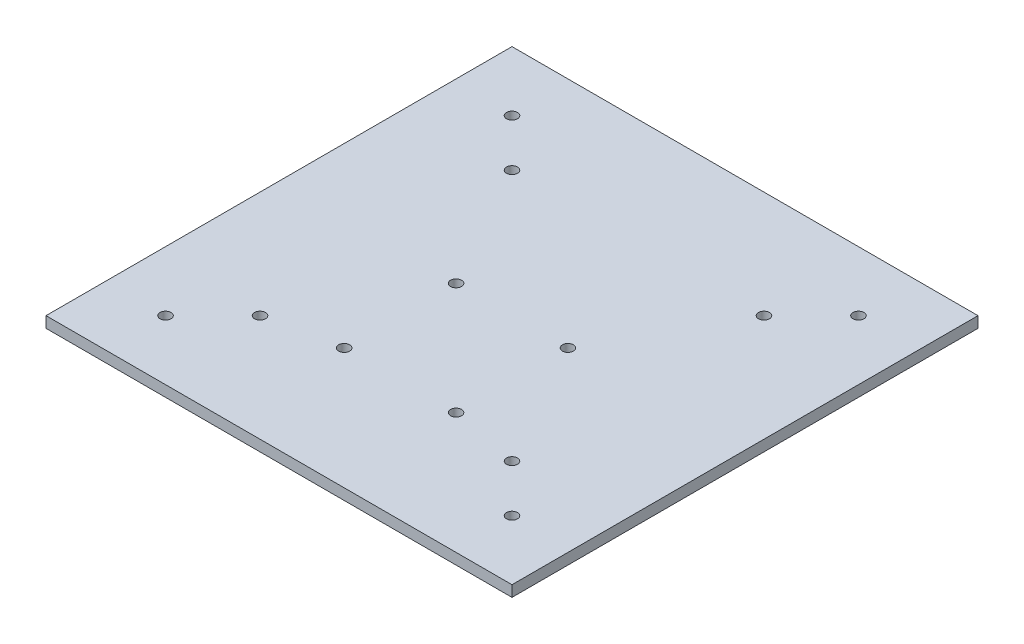
ISO-10303-21;
HEADER;
FILE_DESCRIPTION(('STEP AP214'),'2;1');
FILE_NAME('part.step','',(''),(''),'','','');
FILE_SCHEMA(('AUTOMOTIVE_DESIGN { 1 0 10303 214 1 1 1 1 }'));
ENDSEC;
DATA;
#1=APPLICATION_CONTEXT('core data for automotive mechanical design processes');
#2=APPLICATION_PROTOCOL_DEFINITION('international standard','automotive_design',2000,#1);
#3=PRODUCT_CONTEXT('',#1,'mechanical');
#4=PRODUCT('Part','Part','',(#3));
#5=PRODUCT_RELATED_PRODUCT_CATEGORY('part','',(#4));
#6=PRODUCT_DEFINITION_FORMATION('','',#4);
#7=PRODUCT_DEFINITION_CONTEXT('part definition',#1,'design');
#8=PRODUCT_DEFINITION('design','',#6,#7);
#9=PRODUCT_DEFINITION_SHAPE('','',#8);
#10=(LENGTH_UNIT() NAMED_UNIT(*) SI_UNIT(.MILLI.,.METRE.));
#11=(NAMED_UNIT(*) PLANE_ANGLE_UNIT() SI_UNIT($,.RADIAN.));
#12=(NAMED_UNIT(*) SI_UNIT($,.STERADIAN.) SOLID_ANGLE_UNIT());
#13=UNCERTAINTY_MEASURE_WITH_UNIT(LENGTH_MEASURE(1.E-05),#10,'distance_accuracy_value','');
#14=(GEOMETRIC_REPRESENTATION_CONTEXT(3) GLOBAL_UNCERTAINTY_ASSIGNED_CONTEXT((#13)) GLOBAL_UNIT_ASSIGNED_CONTEXT((#10,
#11,#12)) REPRESENTATION_CONTEXT('',''));
#15=CARTESIAN_POINT('',(0.,0.,0.));
#16=DIRECTION('',(0.,0.,1.));
#17=DIRECTION('',(1.,0.,0.));
#18=AXIS2_PLACEMENT_3D('',#15,#16,#17);
#19=CARTESIAN_POINT('',(-63.5,3.,-63.5));
#20=DIRECTION('',(1.,0.,0.));
#21=DIRECTION('',(0.,0.,-1.));
#22=AXIS2_PLACEMENT_3D('',#19,#20,#21);
#23=PLANE('',#22);
#24=DIRECTION('',(0.,0.,1.));
#25=VECTOR('',#24,1.);
#26=CARTESIAN_POINT('',(-63.5,0.,-63.5));
#27=LINE('',#26,#25);
#28=CARTESIAN_POINT('',(-63.5,0.,-63.5));
#29=VERTEX_POINT('',#28);
#30=CARTESIAN_POINT('',(-63.5,0.,63.5));
#31=VERTEX_POINT('',#30);
#32=EDGE_CURVE('E98',#29,#31,#27,.T.);
#33=ORIENTED_EDGE('',*,*,#32,.T.);
#34=DIRECTION('',(0.,-1.,0.));
#35=VECTOR('',#34,1.);
#36=CARTESIAN_POINT('',(-63.5,3.,63.5));
#37=LINE('',#36,#35);
#38=CARTESIAN_POINT('',(-63.5,3.,63.5));
#39=VERTEX_POINT('',#38);
#40=EDGE_CURVE('E11',#39,#31,#37,.T.);
#41=ORIENTED_EDGE('',*,*,#40,.F.);
#42=DIRECTION('',(0.,0.,1.));
#43=VECTOR('',#42,1.);
#44=CARTESIAN_POINT('',(-63.5,3.,-63.5));
#45=LINE('',#44,#43);
#46=CARTESIAN_POINT('',(-63.5,3.,-63.5));
#47=VERTEX_POINT('',#46);
#48=EDGE_CURVE('E85',#47,#39,#45,.T.);
#49=ORIENTED_EDGE('',*,*,#48,.F.);
#50=DIRECTION('',(0.,-1.,0.));
#51=VECTOR('',#50,1.);
#52=CARTESIAN_POINT('',(-63.5,3.,-63.5));
#53=LINE('',#52,#51);
#54=EDGE_CURVE('E94',#47,#29,#53,.T.);
#55=ORIENTED_EDGE('',*,*,#54,.T.);
#56=EDGE_LOOP('',(#33,#41,#49,#55));
#57=FACE_BOUND('',#56,.T.);
#58=ADVANCED_FACE('F32',(#57),#23,.F.);
#59=CARTESIAN_POINT('',(63.5,3.,63.5));
#60=DIRECTION('',(0.,0.,-1.));
#61=DIRECTION('',(-1.,0.,0.));
#62=AXIS2_PLACEMENT_3D('',#59,#60,#61);
#63=PLANE('',#62);
#64=DIRECTION('',(1.,0.,0.));
#65=VECTOR('',#64,1.);
#66=CARTESIAN_POINT('',(63.5,0.,63.5));
#67=LINE('',#66,#65);
#68=CARTESIAN_POINT('',(63.5,0.,63.5));
#69=VERTEX_POINT('',#68);
#70=EDGE_CURVE('E89',#31,#69,#67,.T.);
#71=ORIENTED_EDGE('',*,*,#70,.T.);
#72=DIRECTION('',(0.,-1.,0.));
#73=VECTOR('',#72,1.);
#74=CARTESIAN_POINT('',(63.5,3.,63.5));
#75=LINE('',#74,#73);
#76=CARTESIAN_POINT('',(63.5,3.,63.5));
#77=VERTEX_POINT('',#76);
#78=EDGE_CURVE('E41',#77,#69,#75,.T.);
#79=ORIENTED_EDGE('',*,*,#78,.F.);
#80=DIRECTION('',(1.,0.,0.));
#81=VECTOR('',#80,1.);
#82=CARTESIAN_POINT('',(63.5,3.,63.5));
#83=LINE('',#82,#81);
#84=EDGE_CURVE('E80',#39,#77,#83,.T.);
#85=ORIENTED_EDGE('',*,*,#84,.F.);
#86=ORIENTED_EDGE('',*,*,#40,.T.);
#87=EDGE_LOOP('',(#71,#79,#85,#86));
#88=FACE_BOUND('',#87,.T.);
#89=ADVANCED_FACE('F88',(#88),#63,.F.);
#90=CARTESIAN_POINT('',(63.5,3.,-63.5));
#91=DIRECTION('',(-1.,0.,0.));
#92=DIRECTION('',(0.,0.,1.));
#93=AXIS2_PLACEMENT_3D('',#90,#91,#92);
#94=PLANE('',#93);
#95=DIRECTION('',(0.,0.,-1.));
#96=VECTOR('',#95,1.);
#97=CARTESIAN_POINT('',(63.5,0.,-63.5));
#98=LINE('',#97,#96);
#99=CARTESIAN_POINT('',(63.5,0.,-63.5));
#100=VERTEX_POINT('',#99);
#101=EDGE_CURVE('E67',#69,#100,#98,.T.);
#102=ORIENTED_EDGE('',*,*,#101,.T.);
#103=DIRECTION('',(0.,-1.,0.));
#104=VECTOR('',#103,1.);
#105=CARTESIAN_POINT('',(63.5,3.,-63.5));
#106=LINE('',#105,#104);
#107=CARTESIAN_POINT('',(63.5,3.,-63.5));
#108=VERTEX_POINT('',#107);
#109=EDGE_CURVE('E90',#108,#100,#106,.T.);
#110=ORIENTED_EDGE('',*,*,#109,.F.);
#111=DIRECTION('',(0.,0.,-1.));
#112=VECTOR('',#111,1.);
#113=CARTESIAN_POINT('',(63.5,3.,-63.5));
#114=LINE('',#113,#112);
#115=EDGE_CURVE('E83',#77,#108,#114,.T.);
#116=ORIENTED_EDGE('',*,*,#115,.F.);
#117=ORIENTED_EDGE('',*,*,#78,.T.);
#118=EDGE_LOOP('',(#102,#110,#116,#117));
#119=FACE_BOUND('',#118,.T.);
#120=ADVANCED_FACE('F92',(#119),#94,.F.);
#121=CARTESIAN_POINT('',(63.5,3.,-63.5));
#122=DIRECTION('',(0.,0.,1.));
#123=DIRECTION('',(1.,0.,0.));
#124=AXIS2_PLACEMENT_3D('',#121,#122,#123);
#125=PLANE('',#124);
#126=DIRECTION('',(-1.,0.,0.));
#127=VECTOR('',#126,1.);
#128=CARTESIAN_POINT('',(63.5,0.,-63.5));
#129=LINE('',#128,#127);
#130=EDGE_CURVE('E73',#100,#29,#129,.T.);
#131=ORIENTED_EDGE('',*,*,#130,.T.);
#132=ORIENTED_EDGE('',*,*,#54,.F.);
#133=DIRECTION('',(-1.,0.,0.));
#134=VECTOR('',#133,1.);
#135=CARTESIAN_POINT('',(63.5,3.,-63.5));
#136=LINE('',#135,#134);
#137=EDGE_CURVE('E50',#108,#47,#136,.T.);
#138=ORIENTED_EDGE('',*,*,#137,.F.);
#139=ORIENTED_EDGE('',*,*,#109,.T.);
#140=EDGE_LOOP('',(#131,#132,#138,#139));
#141=FACE_BOUND('',#140,.T.);
#142=ADVANCED_FACE('F212',(#141),#125,.F.);
#143=CARTESIAN_POINT('',(0.,3.,0.));
#144=DIRECTION('',(0.,-1.,0.));
#145=DIRECTION('',(0.,0.,-1.));
#146=AXIS2_PLACEMENT_3D('',#143,#144,#145);
#147=PLANE('',#146);
#148=CARTESIAN_POINT('',(15.2500000000014,3.,0.));
#149=DIRECTION('',(0.,1.,0.));
#150=DIRECTION('',(0.,0.,1.));
#151=AXIS2_PLACEMENT_3D('',#148,#149,#150);
#152=CIRCLE('',#151,1.5);
#153=CARTESIAN_POINT('',(15.2500000000014,3.,1.50000000000001));
#154=VERTEX_POINT('',#153);
#155=EDGE_CURVE('E367',#154,#154,#152,.T.);
#156=ORIENTED_EDGE('',*,*,#155,.F.);
#157=EDGE_LOOP('',(#156));
#158=FACE_BOUND('',#157,.T.);
#159=CARTESIAN_POINT('',(-15.2499999999986,3.,30.5));
#160=DIRECTION('',(0.,1.,0.));
#161=DIRECTION('',(0.,0.,1.));
#162=AXIS2_PLACEMENT_3D('',#159,#160,#161);
#163=CIRCLE('',#162,1.5);
#164=CARTESIAN_POINT('',(-15.2499999999986,3.,32.));
#165=VERTEX_POINT('',#164);
#166=EDGE_CURVE('E368',#165,#165,#163,.T.);
#167=ORIENTED_EDGE('',*,*,#166,.F.);
#168=EDGE_LOOP('',(#167));
#169=FACE_BOUND('',#168,.T.);
#170=CARTESIAN_POINT('',(15.2500000000014,3.,30.5));
#171=DIRECTION('',(0.,1.,0.));
#172=DIRECTION('',(0.,0.,1.));
#173=AXIS2_PLACEMENT_3D('',#170,#171,#172);
#174=CIRCLE('',#173,1.5);
#175=CARTESIAN_POINT('',(15.2500000000014,3.,32.));
#176=VERTEX_POINT('',#175);
#177=EDGE_CURVE('E372',#176,#176,#174,.T.);
#178=ORIENTED_EDGE('',*,*,#177,.F.);
#179=EDGE_LOOP('',(#178));
#180=FACE_BOUND('',#179,.T.);
#181=CARTESIAN_POINT('',(-15.2499999999986,3.,0.));
#182=DIRECTION('',(0.,1.,0.));
#183=DIRECTION('',(0.,0.,1.));
#184=AXIS2_PLACEMENT_3D('',#181,#182,#183);
#185=CIRCLE('',#184,1.5);
#186=CARTESIAN_POINT('',(-15.2499999999986,3.,1.5));
#187=VERTEX_POINT('',#186);
#188=EDGE_CURVE('E111',#187,#187,#185,.T.);
#189=ORIENTED_EDGE('',*,*,#188,.F.);
#190=EDGE_LOOP('',(#189));
#191=FACE_BOUND('',#190,.T.);
#192=CARTESIAN_POINT('',(47.2146901824547,3.,47.2146901824508));
#193=DIRECTION('',(0.,-1.,0.));
#194=DIRECTION('',(0.,0.,-1.));
#195=AXIS2_PLACEMENT_3D('',#192,#193,#194);
#196=CIRCLE('',#195,1.50000000000288);
#197=CARTESIAN_POINT('',(47.2146901824547,3.,45.7146901824479));
#198=VERTEX_POINT('',#197);
#199=EDGE_CURVE('E101',#198,#198,#196,.T.);
#200=ORIENTED_EDGE('',*,*,#199,.T.);
#201=EDGE_LOOP('',(#200));
#202=FACE_BOUND('',#201,.T.);
#203=CARTESIAN_POINT('',(34.3371440626855,3.,-34.3371440626875));
#204=DIRECTION('',(0.,-1.,0.));
#205=DIRECTION('',(0.,0.,-1.));
#206=AXIS2_PLACEMENT_3D('',#203,#204,#205);
#207=CIRCLE('',#206,1.50000000000203);
#208=CARTESIAN_POINT('',(34.3371440626855,3.,-35.8371440626895));
#209=VERTEX_POINT('',#208);
#210=EDGE_CURVE('E167',#209,#209,#207,.T.);
#211=ORIENTED_EDGE('',*,*,#210,.T.);
#212=EDGE_LOOP('',(#211));
#213=FACE_BOUND('',#212,.T.);
#214=CARTESIAN_POINT('',(47.2146901824528,3.,-47.2146901824547));
#215=DIRECTION('',(0.,-1.,0.));
#216=DIRECTION('',(0.,0.,-1.));
#217=AXIS2_PLACEMENT_3D('',#214,#215,#216);
#218=CIRCLE('',#217,1.50000000000208);
#219=CARTESIAN_POINT('',(47.2146901824528,3.,-48.7146901824568));
#220=VERTEX_POINT('',#219);
#221=EDGE_CURVE('E164',#220,#220,#218,.T.);
#222=ORIENTED_EDGE('',*,*,#221,.T.);
#223=EDGE_LOOP('',(#222));
#224=FACE_BOUND('',#223,.T.);
#225=CARTESIAN_POINT('',(-34.3371440626855,3.,-34.3371440626855));
#226=DIRECTION('',(0.,-1.,0.));
#227=DIRECTION('',(0.,0.,-1.));
#228=AXIS2_PLACEMENT_3D('',#225,#226,#227);
#229=CIRCLE('',#228,1.5);
#230=CARTESIAN_POINT('',(-34.3371440626855,3.,-35.8371440626855));
#231=VERTEX_POINT('',#230);
#232=EDGE_CURVE('E161',#231,#231,#229,.T.);
#233=ORIENTED_EDGE('',*,*,#232,.T.);
#234=EDGE_LOOP('',(#233));
#235=FACE_BOUND('',#234,.T.);
#236=CARTESIAN_POINT('',(-34.3371440626835,3.,34.3371440626855));
#237=DIRECTION('',(0.,-1.,0.));
#238=DIRECTION('',(0.,0.,-1.));
#239=AXIS2_PLACEMENT_3D('',#236,#237,#238);
#240=CIRCLE('',#239,1.50000000000104);
#241=CARTESIAN_POINT('',(-34.3371440626835,3.,32.8371440626845));
#242=VERTEX_POINT('',#241);
#243=EDGE_CURVE('E158',#242,#242,#240,.T.);
#244=ORIENTED_EDGE('',*,*,#243,.T.);
#245=EDGE_LOOP('',(#244));
#246=FACE_BOUND('',#245,.T.);
#247=CARTESIAN_POINT('',(-47.2146901824508,3.,47.2146901824527));
#248=DIRECTION('',(0.,-1.,0.));
#249=DIRECTION('',(0.,0.,-1.));
#250=AXIS2_PLACEMENT_3D('',#247,#248,#249);
#251=CIRCLE('',#250,1.5000000000012);
#252=CARTESIAN_POINT('',(-47.2146901824508,3.,45.7146901824515));
#253=VERTEX_POINT('',#252);
#254=EDGE_CURVE('E155',#253,#253,#251,.T.);
#255=ORIENTED_EDGE('',*,*,#254,.T.);
#256=EDGE_LOOP('',(#255));
#257=FACE_BOUND('',#256,.T.);
#258=CARTESIAN_POINT('',(34.3371440626875,3.,34.3371440626835));
#259=DIRECTION('',(0.,-1.,0.));
#260=DIRECTION('',(0.,0.,-1.));
#261=AXIS2_PLACEMENT_3D('',#258,#259,#260);
#262=CIRCLE('',#261,1.50000000000277);
#263=CARTESIAN_POINT('',(34.3371440626875,3.,32.8371440626808));
#264=VERTEX_POINT('',#263);
#265=EDGE_CURVE('E152',#264,#264,#262,.T.);
#266=ORIENTED_EDGE('',*,*,#265,.T.);
#267=EDGE_LOOP('',(#266));
#268=FACE_BOUND('',#267,.T.);
#269=CARTESIAN_POINT('',(-47.2146901824527,3.,-47.2146901824528));
#270=DIRECTION('',(0.,-1.,0.));
#271=DIRECTION('',(0.,0.,-1.));
#272=AXIS2_PLACEMENT_3D('',#269,#270,#271);
#273=CIRCLE('',#272,1.5);
#274=CARTESIAN_POINT('',(-47.2146901824527,3.,-48.7146901824528));
#275=VERTEX_POINT('',#274);
#276=EDGE_CURVE('E149',#275,#275,#273,.T.);
#277=ORIENTED_EDGE('',*,*,#276,.T.);
#278=EDGE_LOOP('',(#277));
#279=FACE_BOUND('',#278,.T.);
#280=ORIENTED_EDGE('',*,*,#48,.T.);
#281=ORIENTED_EDGE('',*,*,#84,.T.);
#282=ORIENTED_EDGE('',*,*,#115,.T.);
#283=ORIENTED_EDGE('',*,*,#137,.T.);
#284=EDGE_LOOP('',(#280,#281,#282,#283));
#285=FACE_BOUND('',#284,.T.);
#286=ADVANCED_FACE('F81',(#158,#169,#180,#191,#202,#213,#224,#235,#246,#257,#268,#279,#285),
#147,.F.);
#287=CARTESIAN_POINT('',(0.,0.,0.));
#288=DIRECTION('',(0.,-1.,0.));
#289=DIRECTION('',(0.,0.,-1.));
#290=AXIS2_PLACEMENT_3D('',#287,#288,#289);
#291=PLANE('',#290);
#292=CARTESIAN_POINT('',(15.2500000000014,0.,0.));
#293=DIRECTION('',(0.,-1.,0.));
#294=DIRECTION('',(0.,0.,-1.));
#295=AXIS2_PLACEMENT_3D('',#292,#293,#294);
#296=CIRCLE('',#295,1.5);
#297=CARTESIAN_POINT('',(15.2500000000014,0.,-1.49999999999999));
#298=VERTEX_POINT('',#297);
#299=EDGE_CURVE('E35',#298,#298,#296,.T.);
#300=ORIENTED_EDGE('',*,*,#299,.F.);
#301=EDGE_LOOP('',(#300));
#302=FACE_BOUND('',#301,.T.);
#303=CARTESIAN_POINT('',(-15.2499999999986,0.,30.5));
#304=DIRECTION('',(0.,-1.,0.));
#305=DIRECTION('',(0.,0.,-1.));
#306=AXIS2_PLACEMENT_3D('',#303,#304,#305);
#307=CIRCLE('',#306,1.5);
#308=CARTESIAN_POINT('',(-15.2499999999986,0.,29.));
#309=VERTEX_POINT('',#308);
#310=EDGE_CURVE('E113',#309,#309,#307,.T.);
#311=ORIENTED_EDGE('',*,*,#310,.F.);
#312=EDGE_LOOP('',(#311));
#313=FACE_BOUND('',#312,.T.);
#314=CARTESIAN_POINT('',(15.2500000000014,0.,30.5));
#315=DIRECTION('',(0.,-1.,0.));
#316=DIRECTION('',(0.,0.,-1.));
#317=AXIS2_PLACEMENT_3D('',#314,#315,#316);
#318=CIRCLE('',#317,1.5);
#319=CARTESIAN_POINT('',(15.2500000000014,0.,29.));
#320=VERTEX_POINT('',#319);
#321=EDGE_CURVE('E110',#320,#320,#318,.T.);
#322=ORIENTED_EDGE('',*,*,#321,.F.);
#323=EDGE_LOOP('',(#322));
#324=FACE_BOUND('',#323,.T.);
#325=CARTESIAN_POINT('',(-15.2499999999986,0.,0.));
#326=DIRECTION('',(0.,-1.,0.));
#327=DIRECTION('',(0.,0.,-1.));
#328=AXIS2_PLACEMENT_3D('',#325,#326,#327);
#329=CIRCLE('',#328,1.5);
#330=CARTESIAN_POINT('',(-15.2499999999986,0.,-1.5));
#331=VERTEX_POINT('',#330);
#332=EDGE_CURVE('E107',#331,#331,#329,.T.);
#333=ORIENTED_EDGE('',*,*,#332,.F.);
#334=EDGE_LOOP('',(#333));
#335=FACE_BOUND('',#334,.T.);
#336=CARTESIAN_POINT('',(47.2146901824547,0.,47.2146901824508));
#337=DIRECTION('',(0.,1.,0.));
#338=DIRECTION('',(0.,0.,1.));
#339=AXIS2_PLACEMENT_3D('',#336,#337,#338);
#340=CIRCLE('',#339,1.50000000000288);
#341=CARTESIAN_POINT('',(47.2146901824547,0.,48.7146901824537));
#342=VERTEX_POINT('',#341);
#343=EDGE_CURVE('E133',#342,#342,#340,.T.);
#344=ORIENTED_EDGE('',*,*,#343,.T.);
#345=EDGE_LOOP('',(#344));
#346=FACE_BOUND('',#345,.T.);
#347=CARTESIAN_POINT('',(34.3371440626855,0.,-34.3371440626875));
#348=DIRECTION('',(0.,1.,0.));
#349=DIRECTION('',(0.,0.,1.));
#350=AXIS2_PLACEMENT_3D('',#347,#348,#349);
#351=CIRCLE('',#350,1.50000000000203);
#352=CARTESIAN_POINT('',(34.3371440626855,0.,-32.8371440626854));
#353=VERTEX_POINT('',#352);
#354=EDGE_CURVE('E135',#353,#353,#351,.T.);
#355=ORIENTED_EDGE('',*,*,#354,.T.);
#356=EDGE_LOOP('',(#355));
#357=FACE_BOUND('',#356,.T.);
#358=CARTESIAN_POINT('',(47.2146901824528,0.,-47.2146901824547));
#359=DIRECTION('',(0.,1.,0.));
#360=DIRECTION('',(0.,0.,1.));
#361=AXIS2_PLACEMENT_3D('',#358,#359,#360);
#362=CIRCLE('',#361,1.50000000000208);
#363=CARTESIAN_POINT('',(47.2146901824528,0.,-45.7146901824526));
#364=VERTEX_POINT('',#363);
#365=EDGE_CURVE('E138',#364,#364,#362,.T.);
#366=ORIENTED_EDGE('',*,*,#365,.T.);
#367=EDGE_LOOP('',(#366));
#368=FACE_BOUND('',#367,.T.);
#369=CARTESIAN_POINT('',(-34.3371440626855,0.,-34.3371440626855));
#370=DIRECTION('',(0.,1.,0.));
#371=DIRECTION('',(0.,0.,1.));
#372=AXIS2_PLACEMENT_3D('',#369,#370,#371);
#373=CIRCLE('',#372,1.5);
#374=CARTESIAN_POINT('',(-34.3371440626855,0.,-32.8371440626855));
#375=VERTEX_POINT('',#374);
#376=EDGE_CURVE('E141',#375,#375,#373,.T.);
#377=ORIENTED_EDGE('',*,*,#376,.T.);
#378=EDGE_LOOP('',(#377));
#379=FACE_BOUND('',#378,.T.);
#380=CARTESIAN_POINT('',(-34.3371440626835,0.,34.3371440626855));
#381=DIRECTION('',(0.,1.,0.));
#382=DIRECTION('',(0.,0.,1.));
#383=AXIS2_PLACEMENT_3D('',#380,#381,#382);
#384=CIRCLE('',#383,1.50000000000104);
#385=CARTESIAN_POINT('',(-34.3371440626835,0.,35.8371440626866));
#386=VERTEX_POINT('',#385);
#387=EDGE_CURVE('E118',#386,#386,#384,.T.);
#388=ORIENTED_EDGE('',*,*,#387,.T.);
#389=EDGE_LOOP('',(#388));
#390=FACE_BOUND('',#389,.T.);
#391=CARTESIAN_POINT('',(-47.2146901824508,0.,47.2146901824527));
#392=DIRECTION('',(0.,1.,0.));
#393=DIRECTION('',(0.,0.,1.));
#394=AXIS2_PLACEMENT_3D('',#391,#392,#393);
#395=CIRCLE('',#394,1.5000000000012);
#396=CARTESIAN_POINT('',(-47.2146901824508,0.,48.7146901824539));
#397=VERTEX_POINT('',#396);
#398=EDGE_CURVE('E122',#397,#397,#395,.T.);
#399=ORIENTED_EDGE('',*,*,#398,.T.);
#400=EDGE_LOOP('',(#399));
#401=FACE_BOUND('',#400,.T.);
#402=CARTESIAN_POINT('',(34.3371440626875,0.,34.3371440626835));
#403=DIRECTION('',(0.,1.,0.));
#404=DIRECTION('',(0.,0.,1.));
#405=AXIS2_PLACEMENT_3D('',#402,#403,#404);
#406=CIRCLE('',#405,1.50000000000277);
#407=CARTESIAN_POINT('',(34.3371440626875,0.,35.8371440626863));
#408=VERTEX_POINT('',#407);
#409=EDGE_CURVE('E127',#408,#408,#406,.T.);
#410=ORIENTED_EDGE('',*,*,#409,.T.);
#411=EDGE_LOOP('',(#410));
#412=FACE_BOUND('',#411,.T.);
#413=CARTESIAN_POINT('',(-47.2146901824527,0.,-47.2146901824528));
#414=DIRECTION('',(0.,1.,0.));
#415=DIRECTION('',(0.,0.,1.));
#416=AXIS2_PLACEMENT_3D('',#413,#414,#415);
#417=CIRCLE('',#416,1.5);
#418=CARTESIAN_POINT('',(-47.2146901824527,0.,-45.7146901824528));
#419=VERTEX_POINT('',#418);
#420=EDGE_CURVE('E144',#419,#419,#417,.T.);
#421=ORIENTED_EDGE('',*,*,#420,.T.);
#422=EDGE_LOOP('',(#421));
#423=FACE_BOUND('',#422,.T.);
#424=ORIENTED_EDGE('',*,*,#32,.F.);
#425=ORIENTED_EDGE('',*,*,#130,.F.);
#426=ORIENTED_EDGE('',*,*,#101,.F.);
#427=ORIENTED_EDGE('',*,*,#70,.F.);
#428=EDGE_LOOP('',(#424,#425,#426,#427));
#429=FACE_BOUND('',#428,.T.);
#430=ADVANCED_FACE('F200',(#302,#313,#324,#335,#346,#357,#368,#379,#390,#401,#412,#423,#429),
#291,.T.);
#431=CARTESIAN_POINT('',(-47.2146901824527,0.,-47.2146901824528));
#432=DIRECTION('',(0.,1.,0.));
#433=DIRECTION('',(0.,0.,1.));
#434=AXIS2_PLACEMENT_3D('',#431,#432,#433);
#435=CYLINDRICAL_SURFACE('',#434,1.5);
#436=ORIENTED_EDGE('',*,*,#420,.F.);
#437=EDGE_LOOP('',(#436));
#438=FACE_BOUND('',#437,.T.);
#439=ORIENTED_EDGE('',*,*,#276,.F.);
#440=EDGE_LOOP('',(#439));
#441=FACE_BOUND('',#440,.T.);
#442=ADVANCED_FACE('F202',(#438,#441),#435,.F.);
#443=CARTESIAN_POINT('',(34.3371440626875,0.,34.3371440626835));
#444=DIRECTION('',(0.,1.,0.));
#445=DIRECTION('',(0.,0.,1.));
#446=AXIS2_PLACEMENT_3D('',#443,#444,#445);
#447=CYLINDRICAL_SURFACE('',#446,1.50000000000277);
#448=ORIENTED_EDGE('',*,*,#409,.F.);
#449=EDGE_LOOP('',(#448));
#450=FACE_BOUND('',#449,.T.);
#451=ORIENTED_EDGE('',*,*,#265,.F.);
#452=EDGE_LOOP('',(#451));
#453=FACE_BOUND('',#452,.T.);
#454=ADVANCED_FACE('F209',(#450,#453),#447,.F.);
#455=CARTESIAN_POINT('',(-47.2146901824508,0.,47.2146901824527));
#456=DIRECTION('',(0.,1.,0.));
#457=DIRECTION('',(0.,0.,1.));
#458=AXIS2_PLACEMENT_3D('',#455,#456,#457);
#459=CYLINDRICAL_SURFACE('',#458,1.5000000000012);
#460=ORIENTED_EDGE('',*,*,#398,.F.);
#461=EDGE_LOOP('',(#460));
#462=FACE_BOUND('',#461,.T.);
#463=ORIENTED_EDGE('',*,*,#254,.F.);
#464=EDGE_LOOP('',(#463));
#465=FACE_BOUND('',#464,.T.);
#466=ADVANCED_FACE('F284',(#462,#465),#459,.F.);
#467=CARTESIAN_POINT('',(-34.3371440626835,0.,34.3371440626855));
#468=DIRECTION('',(0.,1.,0.));
#469=DIRECTION('',(0.,0.,1.));
#470=AXIS2_PLACEMENT_3D('',#467,#468,#469);
#471=CYLINDRICAL_SURFACE('',#470,1.50000000000104);
#472=ORIENTED_EDGE('',*,*,#387,.F.);
#473=EDGE_LOOP('',(#472));
#474=FACE_BOUND('',#473,.T.);
#475=ORIENTED_EDGE('',*,*,#243,.F.);
#476=EDGE_LOOP('',(#475));
#477=FACE_BOUND('',#476,.T.);
#478=ADVANCED_FACE('F280',(#474,#477),#471,.F.);
#479=CARTESIAN_POINT('',(-34.3371440626855,0.,-34.3371440626855));
#480=DIRECTION('',(0.,1.,0.));
#481=DIRECTION('',(0.,0.,1.));
#482=AXIS2_PLACEMENT_3D('',#479,#480,#481);
#483=CYLINDRICAL_SURFACE('',#482,1.5);
#484=ORIENTED_EDGE('',*,*,#376,.F.);
#485=EDGE_LOOP('',(#484));
#486=FACE_BOUND('',#485,.T.);
#487=ORIENTED_EDGE('',*,*,#232,.F.);
#488=EDGE_LOOP('',(#487));
#489=FACE_BOUND('',#488,.T.);
#490=ADVANCED_FACE('F283',(#486,#489),#483,.F.);
#491=CARTESIAN_POINT('',(47.2146901824528,0.,-47.2146901824547));
#492=DIRECTION('',(0.,1.,0.));
#493=DIRECTION('',(0.,0.,1.));
#494=AXIS2_PLACEMENT_3D('',#491,#492,#493);
#495=CYLINDRICAL_SURFACE('',#494,1.50000000000208);
#496=ORIENTED_EDGE('',*,*,#365,.F.);
#497=EDGE_LOOP('',(#496));
#498=FACE_BOUND('',#497,.T.);
#499=ORIENTED_EDGE('',*,*,#221,.F.);
#500=EDGE_LOOP('',(#499));
#501=FACE_BOUND('',#500,.T.);
#502=ADVANCED_FACE('F188',(#498,#501),#495,.F.);
#503=CARTESIAN_POINT('',(34.3371440626855,0.,-34.3371440626875));
#504=DIRECTION('',(0.,1.,0.));
#505=DIRECTION('',(0.,0.,1.));
#506=AXIS2_PLACEMENT_3D('',#503,#504,#505);
#507=CYLINDRICAL_SURFACE('',#506,1.50000000000203);
#508=ORIENTED_EDGE('',*,*,#354,.F.);
#509=EDGE_LOOP('',(#508));
#510=FACE_BOUND('',#509,.T.);
#511=ORIENTED_EDGE('',*,*,#210,.F.);
#512=EDGE_LOOP('',(#511));
#513=FACE_BOUND('',#512,.T.);
#514=ADVANCED_FACE('F178',(#510,#513),#507,.F.);
#515=CARTESIAN_POINT('',(47.2146901824547,0.,47.2146901824508));
#516=DIRECTION('',(0.,1.,0.));
#517=DIRECTION('',(0.,0.,1.));
#518=AXIS2_PLACEMENT_3D('',#515,#516,#517);
#519=CYLINDRICAL_SURFACE('',#518,1.50000000000288);
#520=ORIENTED_EDGE('',*,*,#343,.F.);
#521=EDGE_LOOP('',(#520));
#522=FACE_BOUND('',#521,.T.);
#523=ORIENTED_EDGE('',*,*,#199,.F.);
#524=EDGE_LOOP('',(#523));
#525=FACE_BOUND('',#524,.T.);
#526=ADVANCED_FACE('F175',(#522,#525),#519,.F.);
#527=CARTESIAN_POINT('',(-15.2499999999986,-7.,0.));
#528=DIRECTION('',(0.,1.,0.));
#529=DIRECTION('',(0.,0.,1.));
#530=AXIS2_PLACEMENT_3D('',#527,#528,#529);
#531=CYLINDRICAL_SURFACE('',#530,1.5);
#532=ORIENTED_EDGE('',*,*,#332,.T.);
#533=EDGE_LOOP('',(#532));
#534=FACE_BOUND('',#533,.T.);
#535=ORIENTED_EDGE('',*,*,#188,.T.);
#536=EDGE_LOOP('',(#535));
#537=FACE_BOUND('',#536,.T.);
#538=ADVANCED_FACE('F177',(#534,#537),#531,.F.);
#539=CARTESIAN_POINT('',(15.2500000000014,-7.,30.5));
#540=DIRECTION('',(0.,1.,0.));
#541=DIRECTION('',(0.,0.,1.));
#542=AXIS2_PLACEMENT_3D('',#539,#540,#541);
#543=CYLINDRICAL_SURFACE('',#542,1.5);
#544=ORIENTED_EDGE('',*,*,#321,.T.);
#545=EDGE_LOOP('',(#544));
#546=FACE_BOUND('',#545,.T.);
#547=ORIENTED_EDGE('',*,*,#177,.T.);
#548=EDGE_LOOP('',(#547));
#549=FACE_BOUND('',#548,.T.);
#550=ADVANCED_FACE('F185',(#546,#549),#543,.F.);
#551=CARTESIAN_POINT('',(-15.2499999999986,-7.,30.5));
#552=DIRECTION('',(0.,1.,0.));
#553=DIRECTION('',(0.,0.,1.));
#554=AXIS2_PLACEMENT_3D('',#551,#552,#553);
#555=CYLINDRICAL_SURFACE('',#554,1.5);
#556=ORIENTED_EDGE('',*,*,#310,.T.);
#557=EDGE_LOOP('',(#556));
#558=FACE_BOUND('',#557,.T.);
#559=ORIENTED_EDGE('',*,*,#166,.T.);
#560=EDGE_LOOP('',(#559));
#561=FACE_BOUND('',#560,.T.);
#562=ADVANCED_FACE('F256',(#558,#561),#555,.F.);
#563=CARTESIAN_POINT('',(15.2500000000014,-7.,0.));
#564=DIRECTION('',(0.,1.,0.));
#565=DIRECTION('',(0.,0.,1.));
#566=AXIS2_PLACEMENT_3D('',#563,#564,#565);
#567=CYLINDRICAL_SURFACE('',#566,1.5);
#568=ORIENTED_EDGE('',*,*,#299,.T.);
#569=EDGE_LOOP('',(#568));
#570=FACE_BOUND('',#569,.T.);
#571=ORIENTED_EDGE('',*,*,#155,.T.);
#572=EDGE_LOOP('',(#571));
#573=FACE_BOUND('',#572,.T.);
#574=ADVANCED_FACE('F266',(#570,#573),#567,.F.);
#575=CLOSED_SHELL('',(#58,#89,#120,#142,#286,#430,#442,#454,#466,#478,#490,#502,#514,#526,#538,
#550,#562,#574));
#576=MANIFOLD_SOLID_BREP('B2',#575);
#577=ADVANCED_BREP_SHAPE_REPRESENTATION('',(#18,#576),#14);
#578=SHAPE_DEFINITION_REPRESENTATION(#9,#577);
ENDSEC;
END-ISO-10303-21;
